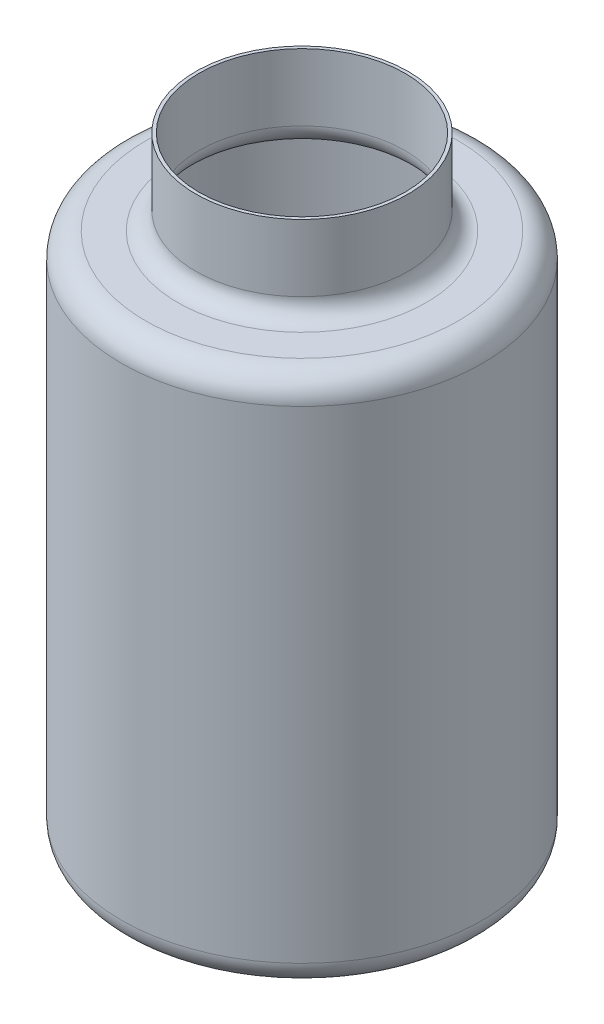
ISO-10303-21;
HEADER;
FILE_DESCRIPTION(('STEP AP214'),'2;1');
FILE_NAME('part.step','',(''),(''),'','','');
FILE_SCHEMA(('AUTOMOTIVE_DESIGN { 1 0 10303 214 1 1 1 1 }'));
ENDSEC;
DATA;
#1=APPLICATION_CONTEXT('core data for automotive mechanical design processes');
#2=APPLICATION_PROTOCOL_DEFINITION('international standard','automotive_design',2000,#1);
#3=PRODUCT_CONTEXT('',#1,'mechanical');
#4=PRODUCT('Part','Part','',(#3));
#5=PRODUCT_RELATED_PRODUCT_CATEGORY('part','',(#4));
#6=PRODUCT_DEFINITION_FORMATION('','',#4);
#7=PRODUCT_DEFINITION_CONTEXT('part definition',#1,'design');
#8=PRODUCT_DEFINITION('design','',#6,#7);
#9=PRODUCT_DEFINITION_SHAPE('','',#8);
#10=(LENGTH_UNIT() NAMED_UNIT(*) SI_UNIT(.MILLI.,.METRE.));
#11=(NAMED_UNIT(*) PLANE_ANGLE_UNIT() SI_UNIT($,.RADIAN.));
#12=(NAMED_UNIT(*) SI_UNIT($,.STERADIAN.) SOLID_ANGLE_UNIT());
#13=UNCERTAINTY_MEASURE_WITH_UNIT(LENGTH_MEASURE(1.E-05),#10,'distance_accuracy_value','');
#14=(GEOMETRIC_REPRESENTATION_CONTEXT(3) GLOBAL_UNCERTAINTY_ASSIGNED_CONTEXT((#13)) GLOBAL_UNIT_ASSIGNED_CONTEXT((#10,
#11,#12)) REPRESENTATION_CONTEXT('',''));
#15=CARTESIAN_POINT('',(0.,0.,0.));
#16=DIRECTION('',(0.,0.,1.));
#17=DIRECTION('',(1.,0.,0.));
#18=AXIS2_PLACEMENT_3D('',#15,#16,#17);
#19=CARTESIAN_POINT('',(37.338,0.,0.));
#20=DIRECTION('',(0.,1.,0.));
#21=DIRECTION('',(0.,0.,1.));
#22=AXIS2_PLACEMENT_3D('',#19,#20,#21);
#23=PLANE('',#22);
#24=CARTESIAN_POINT('',(0.,0.,0.));
#25=DIRECTION('',(0.,-1.,0.));
#26=DIRECTION('',(0.,0.,-1.));
#27=AXIS2_PLACEMENT_3D('',#24,#25,#26);
#28=CIRCLE('',#27,37.338);
#29=CARTESIAN_POINT('',(0.,0.,-37.338));
#30=VERTEX_POINT('',#29);
#31=EDGE_CURVE('E10',#30,#30,#28,.T.);
#32=ORIENTED_EDGE('',*,*,#31,.F.);
#33=EDGE_LOOP('',(#32));
#34=FACE_BOUND('',#33,.T.);
#35=ADVANCED_FACE('F37',(#34),#23,.T.);
#36=CARTESIAN_POINT('',(0.,5.08,0.));
#37=DIRECTION('',(0.,-1.,0.));
#38=DIRECTION('',(0.,0.,-1.));
#39=AXIS2_PLACEMENT_3D('',#36,#37,#38);
#40=TOROIDAL_SURFACE('',#39,37.338,5.08);
#41=ORIENTED_EDGE('',*,*,#31,.T.);
#42=EDGE_LOOP('',(#41));
#43=FACE_BOUND('',#42,.T.);
#44=CARTESIAN_POINT('',(0.,5.08,0.));
#45=DIRECTION('',(0.,-1.,0.));
#46=DIRECTION('',(0.,0.,-1.));
#47=AXIS2_PLACEMENT_3D('',#44,#45,#46);
#48=CIRCLE('',#47,42.418);
#49=CARTESIAN_POINT('',(0.,5.08,-42.418));
#50=VERTEX_POINT('',#49);
#51=EDGE_CURVE('E43',#50,#50,#48,.T.);
#52=ORIENTED_EDGE('',*,*,#51,.F.);
#53=EDGE_LOOP('',(#52));
#54=FACE_BOUND('',#53,.T.);
#55=ADVANCED_FACE('F103',(#43,#54),#40,.F.);
#56=CARTESIAN_POINT('',(0.,-97.3781226462563,0.));
#57=DIRECTION('',(0.,-1.,0.));
#58=DIRECTION('',(0.,0.,-1.));
#59=AXIS2_PLACEMENT_3D('',#56,#57,#58);
#60=CYLINDRICAL_SURFACE('',#59,42.418);
#61=ORIENTED_EDGE('',*,*,#51,.T.);
#62=EDGE_LOOP('',(#61));
#63=FACE_BOUND('',#62,.T.);
#64=CARTESIAN_POINT('',(0.,120.396,0.));
#65=DIRECTION('',(0.,-1.,0.));
#66=DIRECTION('',(0.,0.,-1.));
#67=AXIS2_PLACEMENT_3D('',#64,#65,#66);
#68=CIRCLE('',#67,42.418);
#69=CARTESIAN_POINT('',(0.,120.396,-42.418));
#70=VERTEX_POINT('',#69);
#71=EDGE_CURVE('E47',#70,#70,#68,.T.);
#72=ORIENTED_EDGE('',*,*,#71,.F.);
#73=EDGE_LOOP('',(#72));
#74=FACE_BOUND('',#73,.T.);
#75=ADVANCED_FACE('F108',(#63,#74),#60,.F.);
#76=CARTESIAN_POINT('',(0.,120.396,0.));
#77=DIRECTION('',(0.,-1.,0.));
#78=DIRECTION('',(0.,0.,-1.));
#79=AXIS2_PLACEMENT_3D('',#76,#77,#78);
#80=TOROIDAL_SURFACE('',#79,37.338,5.08);
#81=ORIENTED_EDGE('',*,*,#71,.T.);
#82=EDGE_LOOP('',(#81));
#83=FACE_BOUND('',#82,.T.);
#84=CARTESIAN_POINT('',(0.,125.476,0.));
#85=DIRECTION('',(0.,-1.,0.));
#86=DIRECTION('',(0.,0.,-1.));
#87=AXIS2_PLACEMENT_3D('',#84,#85,#86);
#88=CIRCLE('',#87,37.338);
#89=CARTESIAN_POINT('',(0.,125.476,-37.338));
#90=VERTEX_POINT('',#89);
#91=EDGE_CURVE('E51',#90,#90,#88,.T.);
#92=ORIENTED_EDGE('',*,*,#91,.F.);
#93=EDGE_LOOP('',(#92));
#94=FACE_BOUND('',#93,.T.);
#95=ADVANCED_FACE('F112',(#83,#94),#80,.F.);
#96=CARTESIAN_POINT('',(29.718,125.476,0.));
#97=DIRECTION('',(0.,-1.,0.));
#98=DIRECTION('',(0.,0.,-1.));
#99=AXIS2_PLACEMENT_3D('',#96,#97,#98);
#100=PLANE('',#99);
#101=ORIENTED_EDGE('',*,*,#91,.T.);
#102=EDGE_LOOP('',(#101));
#103=FACE_BOUND('',#102,.T.);
#104=CARTESIAN_POINT('',(0.,125.476,0.));
#105=DIRECTION('',(0.,-1.,0.));
#106=DIRECTION('',(0.,0.,-1.));
#107=AXIS2_PLACEMENT_3D('',#104,#105,#106);
#108=CIRCLE('',#107,29.718);
#109=CARTESIAN_POINT('',(0.,125.476,-29.718));
#110=VERTEX_POINT('',#109);
#111=EDGE_CURVE('E56',#110,#110,#108,.T.);
#112=ORIENTED_EDGE('',*,*,#111,.F.);
#113=EDGE_LOOP('',(#112));
#114=FACE_BOUND('',#113,.T.);
#115=ADVANCED_FACE('F118',(#103,#114),#100,.T.);
#116=CARTESIAN_POINT('',(0.,130.556,0.));
#117=DIRECTION('',(0.,-1.,0.));
#118=DIRECTION('',(0.,0.,-1.));
#119=AXIS2_PLACEMENT_3D('',#116,#117,#118);
#120=TOROIDAL_SURFACE('',#119,29.718,5.08);
#121=ORIENTED_EDGE('',*,*,#111,.T.);
#122=EDGE_LOOP('',(#121));
#123=FACE_BOUND('',#122,.T.);
#124=CARTESIAN_POINT('',(0.,130.556,0.));
#125=DIRECTION('',(0.,-1.,0.));
#126=DIRECTION('',(0.,0.,-1.));
#127=AXIS2_PLACEMENT_3D('',#124,#125,#126);
#128=CIRCLE('',#127,24.638);
#129=CARTESIAN_POINT('',(0.,130.556,-24.638));
#130=VERTEX_POINT('',#129);
#131=EDGE_CURVE('E59',#130,#130,#128,.T.);
#132=ORIENTED_EDGE('',*,*,#131,.F.);
#133=EDGE_LOOP('',(#132));
#134=FACE_BOUND('',#133,.T.);
#135=ADVANCED_FACE('F122',(#123,#134),#120,.T.);
#136=CARTESIAN_POINT('',(0.,-97.3781226462563,0.));
#137=DIRECTION('',(0.,-1.,0.));
#138=DIRECTION('',(0.,0.,-1.));
#139=AXIS2_PLACEMENT_3D('',#136,#137,#138);
#140=CYLINDRICAL_SURFACE('',#139,24.638);
#141=ORIENTED_EDGE('',*,*,#131,.T.);
#142=EDGE_LOOP('',(#141));
#143=FACE_BOUND('',#142,.T.);
#144=CARTESIAN_POINT('',(0.,146.558,0.));
#145=DIRECTION('',(0.,-1.,0.));
#146=DIRECTION('',(0.,0.,-1.));
#147=AXIS2_PLACEMENT_3D('',#144,#145,#146);
#148=CIRCLE('',#147,24.638);
#149=CARTESIAN_POINT('',(0.,146.558,-24.638));
#150=VERTEX_POINT('',#149);
#151=EDGE_CURVE('E62',#150,#150,#148,.T.);
#152=ORIENTED_EDGE('',*,*,#151,.F.);
#153=EDGE_LOOP('',(#152));
#154=FACE_BOUND('',#153,.T.);
#155=ADVANCED_FACE('F126',(#143,#154),#140,.F.);
#156=CARTESIAN_POINT('',(25.4,146.558,0.));
#157=DIRECTION('',(0.,1.,0.));
#158=DIRECTION('',(0.,0.,1.));
#159=AXIS2_PLACEMENT_3D('',#156,#157,#158);
#160=PLANE('',#159);
#161=ORIENTED_EDGE('',*,*,#151,.T.);
#162=EDGE_LOOP('',(#161));
#163=FACE_BOUND('',#162,.T.);
#164=CARTESIAN_POINT('',(0.,146.558,0.));
#165=DIRECTION('',(0.,-1.,0.));
#166=DIRECTION('',(0.,0.,-1.));
#167=AXIS2_PLACEMENT_3D('',#164,#165,#166);
#168=CIRCLE('',#167,25.4);
#169=CARTESIAN_POINT('',(0.,146.558,-25.4));
#170=VERTEX_POINT('',#169);
#171=EDGE_CURVE('E65',#170,#170,#168,.T.);
#172=ORIENTED_EDGE('',*,*,#171,.F.);
#173=EDGE_LOOP('',(#172));
#174=FACE_BOUND('',#173,.T.);
#175=ADVANCED_FACE('F130',(#163,#174),#160,.T.);
#176=CARTESIAN_POINT('',(0.,-97.3781226462563,0.));
#177=DIRECTION('',(0.,-1.,0.));
#178=DIRECTION('',(0.,0.,-1.));
#179=AXIS2_PLACEMENT_3D('',#176,#177,#178);
#180=CYLINDRICAL_SURFACE('',#179,25.4);
#181=ORIENTED_EDGE('',*,*,#171,.T.);
#182=EDGE_LOOP('',(#181));
#183=FACE_BOUND('',#182,.T.);
#184=CARTESIAN_POINT('',(0.,130.556,0.));
#185=DIRECTION('',(0.,-1.,0.));
#186=DIRECTION('',(0.,0.,-1.));
#187=AXIS2_PLACEMENT_3D('',#184,#185,#186);
#188=CIRCLE('',#187,25.4);
#189=CARTESIAN_POINT('',(0.,130.556,-25.4));
#190=VERTEX_POINT('',#189);
#191=EDGE_CURVE('E68',#190,#190,#188,.T.);
#192=ORIENTED_EDGE('',*,*,#191,.F.);
#193=EDGE_LOOP('',(#192));
#194=FACE_BOUND('',#193,.T.);
#195=ADVANCED_FACE('F134',(#183,#194),#180,.T.);
#196=CARTESIAN_POINT('',(0.,130.556,0.));
#197=DIRECTION('',(0.,-1.,0.));
#198=DIRECTION('',(0.,0.,-1.));
#199=AXIS2_PLACEMENT_3D('',#196,#197,#198);
#200=TOROIDAL_SURFACE('',#199,29.718,4.31799999999999);
#201=ORIENTED_EDGE('',*,*,#191,.T.);
#202=EDGE_LOOP('',(#201));
#203=FACE_BOUND('',#202,.T.);
#204=CARTESIAN_POINT('',(0.,126.238,0.));
#205=DIRECTION('',(0.,-1.,0.));
#206=DIRECTION('',(0.,0.,-1.));
#207=AXIS2_PLACEMENT_3D('',#204,#205,#206);
#208=CIRCLE('',#207,29.718);
#209=CARTESIAN_POINT('',(0.,126.238,-29.718));
#210=VERTEX_POINT('',#209);
#211=EDGE_CURVE('E71',#210,#210,#208,.T.);
#212=ORIENTED_EDGE('',*,*,#211,.F.);
#213=EDGE_LOOP('',(#212));
#214=FACE_BOUND('',#213,.T.);
#215=ADVANCED_FACE('F138',(#203,#214),#200,.F.);
#216=CARTESIAN_POINT('',(29.718,126.238,0.));
#217=DIRECTION('',(0.,1.,0.));
#218=DIRECTION('',(0.,0.,1.));
#219=AXIS2_PLACEMENT_3D('',#216,#217,#218);
#220=PLANE('',#219);
#221=ORIENTED_EDGE('',*,*,#211,.T.);
#222=EDGE_LOOP('',(#221));
#223=FACE_BOUND('',#222,.T.);
#224=CARTESIAN_POINT('',(0.,126.238,0.));
#225=DIRECTION('',(0.,-1.,0.));
#226=DIRECTION('',(0.,0.,-1.));
#227=AXIS2_PLACEMENT_3D('',#224,#225,#226);
#228=CIRCLE('',#227,37.338);
#229=CARTESIAN_POINT('',(0.,126.238,-37.338));
#230=VERTEX_POINT('',#229);
#231=EDGE_CURVE('E74',#230,#230,#228,.T.);
#232=ORIENTED_EDGE('',*,*,#231,.F.);
#233=EDGE_LOOP('',(#232));
#234=FACE_BOUND('',#233,.T.);
#235=ADVANCED_FACE('F142',(#223,#234),#220,.T.);
#236=CARTESIAN_POINT('',(0.,120.396,0.));
#237=DIRECTION('',(0.,-1.,0.));
#238=DIRECTION('',(0.,0.,-1.));
#239=AXIS2_PLACEMENT_3D('',#236,#237,#238);
#240=TOROIDAL_SURFACE('',#239,37.338,5.84200000000001);
#241=ORIENTED_EDGE('',*,*,#231,.T.);
#242=EDGE_LOOP('',(#241));
#243=FACE_BOUND('',#242,.T.);
#244=CARTESIAN_POINT('',(0.,120.396,0.));
#245=DIRECTION('',(0.,-1.,0.));
#246=DIRECTION('',(0.,0.,-1.));
#247=AXIS2_PLACEMENT_3D('',#244,#245,#246);
#248=CIRCLE('',#247,43.18);
#249=CARTESIAN_POINT('',(0.,120.396,-43.18));
#250=VERTEX_POINT('',#249);
#251=EDGE_CURVE('E77',#250,#250,#248,.T.);
#252=ORIENTED_EDGE('',*,*,#251,.F.);
#253=EDGE_LOOP('',(#252));
#254=FACE_BOUND('',#253,.T.);
#255=ADVANCED_FACE('F99',(#243,#254),#240,.T.);
#256=CARTESIAN_POINT('',(0.,-97.3781226462563,0.));
#257=DIRECTION('',(0.,-1.,0.));
#258=DIRECTION('',(0.,0.,-1.));
#259=AXIS2_PLACEMENT_3D('',#256,#257,#258);
#260=CYLINDRICAL_SURFACE('',#259,43.18);
#261=ORIENTED_EDGE('',*,*,#251,.T.);
#262=EDGE_LOOP('',(#261));
#263=FACE_BOUND('',#262,.T.);
#264=CARTESIAN_POINT('',(0.,5.08,0.));
#265=DIRECTION('',(0.,-1.,0.));
#266=DIRECTION('',(0.,0.,-1.));
#267=AXIS2_PLACEMENT_3D('',#264,#265,#266);
#268=CIRCLE('',#267,43.18);
#269=CARTESIAN_POINT('',(0.,5.08,-43.18));
#270=VERTEX_POINT('',#269);
#271=EDGE_CURVE('E80',#270,#270,#268,.T.);
#272=ORIENTED_EDGE('',*,*,#271,.F.);
#273=EDGE_LOOP('',(#272));
#274=FACE_BOUND('',#273,.T.);
#275=ADVANCED_FACE('F91',(#263,#274),#260,.T.);
#276=CARTESIAN_POINT('',(0.,5.08,0.));
#277=DIRECTION('',(0.,-1.,0.));
#278=DIRECTION('',(0.,0.,-1.));
#279=AXIS2_PLACEMENT_3D('',#276,#277,#278);
#280=TOROIDAL_SURFACE('',#279,37.338,5.842);
#281=ORIENTED_EDGE('',*,*,#271,.T.);
#282=EDGE_LOOP('',(#281));
#283=FACE_BOUND('',#282,.T.);
#284=CARTESIAN_POINT('',(0.,-0.761999999999999,0.));
#285=DIRECTION('',(0.,-1.,0.));
#286=DIRECTION('',(0.,0.,-1.));
#287=AXIS2_PLACEMENT_3D('',#284,#285,#286);
#288=CIRCLE('',#287,37.338);
#289=CARTESIAN_POINT('',(0.,-0.761999999999999,-37.338));
#290=VERTEX_POINT('',#289);
#291=EDGE_CURVE('E83',#290,#290,#288,.T.);
#292=ORIENTED_EDGE('',*,*,#291,.F.);
#293=EDGE_LOOP('',(#292));
#294=FACE_BOUND('',#293,.T.);
#295=ADVANCED_FACE('F89',(#283,#294),#280,.T.);
#296=CARTESIAN_POINT('',(37.338,-0.762000000000002,0.));
#297=DIRECTION('',(0.,-1.,0.));
#298=DIRECTION('',(0.,0.,-1.));
#299=AXIS2_PLACEMENT_3D('',#296,#297,#298);
#300=PLANE('',#299);
#301=ORIENTED_EDGE('',*,*,#291,.T.);
#302=EDGE_LOOP('',(#301));
#303=FACE_BOUND('',#302,.T.);
#304=ADVANCED_FACE('F87',(#303),#300,.T.);
#305=CLOSED_SHELL('',(#35,#55,#75,#95,#115,#135,#155,#175,#195,#215,#235,#255,#275,#295,#304));
#306=MANIFOLD_SOLID_BREP('B2',#305);
#307=ADVANCED_BREP_SHAPE_REPRESENTATION('',(#18,#306),#14);
#308=SHAPE_DEFINITION_REPRESENTATION(#9,#307);
ENDSEC;
END-ISO-10303-21;
